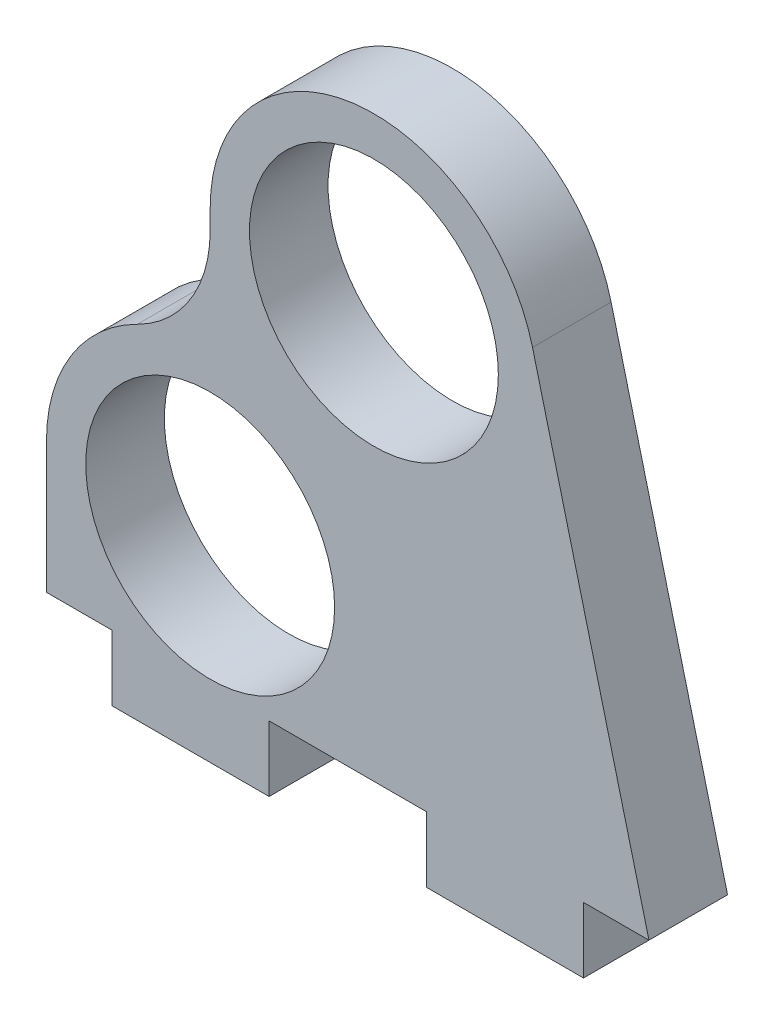
ISO-10303-21;
HEADER;
FILE_DESCRIPTION(('STEP AP214'),'2;1');
FILE_NAME('part.step','',(''),(''),'','','');
FILE_SCHEMA(('AUTOMOTIVE_DESIGN { 1 0 10303 214 1 1 1 1 }'));
ENDSEC;
DATA;
#1=APPLICATION_CONTEXT('core data for automotive mechanical design processes');
#2=APPLICATION_PROTOCOL_DEFINITION('international standard','automotive_design',2000,#1);
#3=PRODUCT_CONTEXT('',#1,'mechanical');
#4=PRODUCT('Part','Part','',(#3));
#5=PRODUCT_RELATED_PRODUCT_CATEGORY('part','',(#4));
#6=PRODUCT_DEFINITION_FORMATION('','',#4);
#7=PRODUCT_DEFINITION_CONTEXT('part definition',#1,'design');
#8=PRODUCT_DEFINITION('design','',#6,#7);
#9=PRODUCT_DEFINITION_SHAPE('','',#8);
#10=(LENGTH_UNIT() NAMED_UNIT(*) SI_UNIT(.MILLI.,.METRE.));
#11=(NAMED_UNIT(*) PLANE_ANGLE_UNIT() SI_UNIT($,.RADIAN.));
#12=(NAMED_UNIT(*) SI_UNIT($,.STERADIAN.) SOLID_ANGLE_UNIT());
#13=UNCERTAINTY_MEASURE_WITH_UNIT(LENGTH_MEASURE(1.E-05),#10,'distance_accuracy_value','');
#14=(GEOMETRIC_REPRESENTATION_CONTEXT(3) GLOBAL_UNCERTAINTY_ASSIGNED_CONTEXT((#13)) GLOBAL_UNIT_ASSIGNED_CONTEXT((#10,
#11,#12)) REPRESENTATION_CONTEXT('',''));
#15=CARTESIAN_POINT('',(0.,0.,0.));
#16=DIRECTION('',(0.,0.,1.));
#17=DIRECTION('',(1.,0.,0.));
#18=AXIS2_PLACEMENT_3D('',#15,#16,#17);
#19=CARTESIAN_POINT('',(12.5000000000001,21.6506350946109,6.));
#20=DIRECTION('',(0.,0.,1.));
#21=DIRECTION('',(1.,0.,0.));
#22=AXIS2_PLACEMENT_3D('',#19,#20,#21);
#23=PLANE('',#22);
#24=CARTESIAN_POINT('',(0.,0.,6.));
#25=DIRECTION('',(0.,0.,1.));
#26=DIRECTION('',(1.,0.,0.));
#27=AXIS2_PLACEMENT_3D('',#24,#25,#26);
#28=CIRCLE('',#27,9.5);
#29=CARTESIAN_POINT('',(9.5,0.,6.));
#30=VERTEX_POINT('',#29);
#31=EDGE_CURVE('E176',#30,#30,#28,.T.);
#32=ORIENTED_EDGE('',*,*,#31,.F.);
#33=EDGE_LOOP('',(#32));
#34=FACE_BOUND('',#33,.T.);
#35=DIRECTION('',(1.,0.,0.));
#36=VECTOR('',#35,1.);
#37=CARTESIAN_POINT('',(-12.5,-10.,6.));
#38=LINE('',#37,#36);
#39=CARTESIAN_POINT('',(-12.5,-10.,6.));
#40=VERTEX_POINT('',#39);
#41=CARTESIAN_POINT('',(-7.5,-10.,6.));
#42=VERTEX_POINT('',#41);
#43=EDGE_CURVE('E201',#40,#42,#38,.T.);
#44=ORIENTED_EDGE('',*,*,#43,.T.);
#45=DIRECTION('',(0.,-1.,0.));
#46=VECTOR('',#45,1.);
#47=CARTESIAN_POINT('',(-7.5,-15.,6.));
#48=LINE('',#47,#46);
#49=CARTESIAN_POINT('',(-7.5,-15.,6.));
#50=VERTEX_POINT('',#49);
#51=EDGE_CURVE('E114',#42,#50,#48,.T.);
#52=ORIENTED_EDGE('',*,*,#51,.T.);
#53=DIRECTION('',(1.,0.,0.));
#54=VECTOR('',#53,1.);
#55=CARTESIAN_POINT('',(4.5,-15.,6.));
#56=LINE('',#55,#54);
#57=CARTESIAN_POINT('',(4.5,-15.,6.));
#58=VERTEX_POINT('',#57);
#59=EDGE_CURVE('E237',#50,#58,#56,.T.);
#60=ORIENTED_EDGE('',*,*,#59,.T.);
#61=DIRECTION('',(0.,1.,0.));
#62=VECTOR('',#61,1.);
#63=CARTESIAN_POINT('',(4.5,-15.,6.));
#64=LINE('',#63,#62);
#65=CARTESIAN_POINT('',(4.5,-10.,6.));
#66=VERTEX_POINT('',#65);
#67=EDGE_CURVE('E256',#58,#66,#64,.T.);
#68=ORIENTED_EDGE('',*,*,#67,.T.);
#69=DIRECTION('',(1.,0.,0.));
#70=VECTOR('',#69,1.);
#71=CARTESIAN_POINT('',(16.5,-10.,6.));
#72=LINE('',#71,#70);
#73=CARTESIAN_POINT('',(16.5,-10.,6.));
#74=VERTEX_POINT('',#73);
#75=EDGE_CURVE('E253',#66,#74,#72,.T.);
#76=ORIENTED_EDGE('',*,*,#75,.T.);
#77=DIRECTION('',(0.,-1.,0.));
#78=VECTOR('',#77,1.);
#79=CARTESIAN_POINT('',(16.5,-15.,6.));
#80=LINE('',#79,#78);
#81=CARTESIAN_POINT('',(16.5,-15.,6.));
#82=VERTEX_POINT('',#81);
#83=EDGE_CURVE('E255',#74,#82,#80,.T.);
#84=ORIENTED_EDGE('',*,*,#83,.T.);
#85=DIRECTION('',(1.,0.,0.));
#86=VECTOR('',#85,1.);
#87=CARTESIAN_POINT('',(28.5,-15.,6.));
#88=LINE('',#87,#86);
#89=CARTESIAN_POINT('',(28.5,-15.,6.));
#90=VERTEX_POINT('',#89);
#91=EDGE_CURVE('E258',#82,#90,#88,.T.);
#92=ORIENTED_EDGE('',*,*,#91,.T.);
#93=DIRECTION('',(0.,1.,0.));
#94=VECTOR('',#93,1.);
#95=CARTESIAN_POINT('',(28.5,-15.,6.));
#96=LINE('',#95,#94);
#97=CARTESIAN_POINT('',(28.5,-10.,6.));
#98=VERTEX_POINT('',#97);
#99=EDGE_CURVE('E264',#90,#98,#96,.T.);
#100=ORIENTED_EDGE('',*,*,#99,.T.);
#101=DIRECTION('',(1.,0.,0.));
#102=VECTOR('',#101,1.);
#103=CARTESIAN_POINT('',(28.5,-10.,6.));
#104=LINE('',#103,#102);
#105=CARTESIAN_POINT('',(33.5,-10.,6.));
#106=VERTEX_POINT('',#105);
#107=EDGE_CURVE('E266',#98,#106,#104,.T.);
#108=ORIENTED_EDGE('',*,*,#107,.T.);
#109=DIRECTION('',(-0.247854237885738,0.96879733523688,0.));
#110=VECTOR('',#109,1.);
#111=CARTESIAN_POINT('',(33.5,-10.,6.));
#112=LINE('',#111,#110);
#113=CARTESIAN_POINT('',(24.6099666904611,24.7488130681826,6.));
#114=VERTEX_POINT('',#113);
#115=EDGE_CURVE('E268',#106,#114,#112,.T.);
#116=ORIENTED_EDGE('',*,*,#115,.T.);
#117=CARTESIAN_POINT('',(12.5000000000001,21.6506350946109,6.));
#118=DIRECTION('',(0.,0.,1.));
#119=DIRECTION('',(1.,0.,0.));
#120=AXIS2_PLACEMENT_3D('',#117,#118,#119);
#121=CIRCLE('',#120,12.5);
#122=CARTESIAN_POINT('',(0.,21.6506350946108,6.));
#123=VERTEX_POINT('',#122);
#124=EDGE_CURVE('E270',#114,#123,#121,.T.);
#125=ORIENTED_EDGE('',*,*,#124,.T.);
#126=DIRECTION('',(0.,-1.,0.));
#127=VECTOR('',#126,1.);
#128=CARTESIAN_POINT('',(0.,21.6506350946108,6.));
#129=LINE('',#128,#127);
#130=CARTESIAN_POINT('',(0.,20.1556443707463,6.));
#131=VERTEX_POINT('',#130);
#132=EDGE_CURVE('E154',#123,#131,#129,.T.);
#133=ORIENTED_EDGE('',*,*,#132,.T.);
#134=CARTESIAN_POINT('',(-9.99999999999992,20.1556443707464,6.));
#135=DIRECTION('',(0.,0.,-1.));
#136=DIRECTION('',(-1.,0.,0.));
#137=AXIS2_PLACEMENT_3D('',#134,#135,#136);
#138=CIRCLE('',#137,10.);
#139=CARTESIAN_POINT('',(-5.55555555555551,11.1975802059702,6.));
#140=VERTEX_POINT('',#139);
#141=EDGE_CURVE('E148',#131,#140,#138,.T.);
#142=ORIENTED_EDGE('',*,*,#141,.T.);
#143=CARTESIAN_POINT('',(0.,0.,6.));
#144=DIRECTION('',(0.,0.,1.));
#145=DIRECTION('',(1.,0.,0.));
#146=AXIS2_PLACEMENT_3D('',#143,#144,#145);
#147=CIRCLE('',#146,12.5);
#148=CARTESIAN_POINT('',(-12.5,0.,6.));
#149=VERTEX_POINT('',#148);
#150=EDGE_CURVE('E152',#140,#149,#147,.T.);
#151=ORIENTED_EDGE('',*,*,#150,.T.);
#152=DIRECTION('',(0.,-1.,0.));
#153=VECTOR('',#152,1.);
#154=CARTESIAN_POINT('',(-12.5,0.,6.));
#155=LINE('',#154,#153);
#156=EDGE_CURVE('E50',#149,#40,#155,.T.);
#157=ORIENTED_EDGE('',*,*,#156,.T.);
#158=EDGE_LOOP('',(#44,#52,#60,#68,#76,#84,#92,#100,#108,#116,#125,#133,#142,#151,#157));
#159=FACE_BOUND('',#158,.T.);
#160=CARTESIAN_POINT('',(12.5000000000001,21.6506350946109,6.));
#161=DIRECTION('',(0.,0.,1.));
#162=DIRECTION('',(1.,0.,0.));
#163=AXIS2_PLACEMENT_3D('',#160,#161,#162);
#164=CIRCLE('',#163,9.5);
#165=CARTESIAN_POINT('',(22.0000000000001,21.6506350946109,6.));
#166=VERTEX_POINT('',#165);
#167=EDGE_CURVE('E312',#166,#166,#164,.T.);
#168=ORIENTED_EDGE('',*,*,#167,.F.);
#169=EDGE_LOOP('',(#168));
#170=FACE_BOUND('',#169,.T.);
#171=ADVANCED_FACE('F33',(#34,#159,#170),#23,.T.);
#172=CARTESIAN_POINT('',(12.5000000000001,21.6506350946109,0.));
#173=DIRECTION('',(0.,0.,1.));
#174=DIRECTION('',(1.,0.,0.));
#175=AXIS2_PLACEMENT_3D('',#172,#173,#174);
#176=PLANE('',#175);
#177=DIRECTION('',(1.,0.,0.));
#178=VECTOR('',#177,1.);
#179=CARTESIAN_POINT('',(-12.5,-10.,0.));
#180=LINE('',#179,#178);
#181=CARTESIAN_POINT('',(-12.5,-10.,0.));
#182=VERTEX_POINT('',#181);
#183=CARTESIAN_POINT('',(-7.5,-10.,0.));
#184=VERTEX_POINT('',#183);
#185=EDGE_CURVE('E172',#182,#184,#180,.T.);
#186=ORIENTED_EDGE('',*,*,#185,.F.);
#187=DIRECTION('',(0.,-1.,0.));
#188=VECTOR('',#187,1.);
#189=CARTESIAN_POINT('',(-12.5,0.,0.));
#190=LINE('',#189,#188);
#191=CARTESIAN_POINT('',(-12.5,0.,0.));
#192=VERTEX_POINT('',#191);
#193=EDGE_CURVE('E106',#192,#182,#190,.T.);
#194=ORIENTED_EDGE('',*,*,#193,.F.);
#195=CARTESIAN_POINT('',(0.,0.,0.));
#196=DIRECTION('',(0.,0.,1.));
#197=DIRECTION('',(1.,0.,0.));
#198=AXIS2_PLACEMENT_3D('',#195,#196,#197);
#199=CIRCLE('',#198,12.5);
#200=CARTESIAN_POINT('',(-5.55555555555551,11.1975802059702,0.));
#201=VERTEX_POINT('',#200);
#202=EDGE_CURVE('E100',#201,#192,#199,.T.);
#203=ORIENTED_EDGE('',*,*,#202,.F.);
#204=CARTESIAN_POINT('',(-9.99999999999992,20.1556443707464,0.));
#205=DIRECTION('',(0.,0.,-1.));
#206=DIRECTION('',(-1.,0.,0.));
#207=AXIS2_PLACEMENT_3D('',#204,#205,#206);
#208=CIRCLE('',#207,10.);
#209=CARTESIAN_POINT('',(0.,20.1556443707463,0.));
#210=VERTEX_POINT('',#209);
#211=EDGE_CURVE('E162',#210,#201,#208,.T.);
#212=ORIENTED_EDGE('',*,*,#211,.F.);
#213=DIRECTION('',(0.,-1.,0.));
#214=VECTOR('',#213,1.);
#215=CARTESIAN_POINT('',(0.,21.6506350946108,0.));
#216=LINE('',#215,#214);
#217=CARTESIAN_POINT('',(0.,21.6506350946108,0.));
#218=VERTEX_POINT('',#217);
#219=EDGE_CURVE('E196',#218,#210,#216,.T.);
#220=ORIENTED_EDGE('',*,*,#219,.F.);
#221=CARTESIAN_POINT('',(12.5000000000001,21.6506350946109,0.));
#222=DIRECTION('',(0.,0.,1.));
#223=DIRECTION('',(1.,0.,0.));
#224=AXIS2_PLACEMENT_3D('',#221,#222,#223);
#225=CIRCLE('',#224,12.5);
#226=CARTESIAN_POINT('',(24.6099666904611,24.7488130681826,0.));
#227=VERTEX_POINT('',#226);
#228=EDGE_CURVE('E194',#227,#218,#225,.T.);
#229=ORIENTED_EDGE('',*,*,#228,.F.);
#230=DIRECTION('',(-0.247854237885738,0.96879733523688,0.));
#231=VECTOR('',#230,1.);
#232=CARTESIAN_POINT('',(33.5,-10.,0.));
#233=LINE('',#232,#231);
#234=CARTESIAN_POINT('',(33.5,-10.,0.));
#235=VERTEX_POINT('',#234);
#236=EDGE_CURVE('E192',#235,#227,#233,.T.);
#237=ORIENTED_EDGE('',*,*,#236,.F.);
#238=DIRECTION('',(1.,0.,0.));
#239=VECTOR('',#238,1.);
#240=CARTESIAN_POINT('',(28.5,-10.,0.));
#241=LINE('',#240,#239);
#242=CARTESIAN_POINT('',(28.5,-10.,0.));
#243=VERTEX_POINT('',#242);
#244=EDGE_CURVE('E190',#243,#235,#241,.T.);
#245=ORIENTED_EDGE('',*,*,#244,.F.);
#246=DIRECTION('',(0.,1.,0.));
#247=VECTOR('',#246,1.);
#248=CARTESIAN_POINT('',(28.5,-15.,0.));
#249=LINE('',#248,#247);
#250=CARTESIAN_POINT('',(28.5,-15.,0.));
#251=VERTEX_POINT('',#250);
#252=EDGE_CURVE('E188',#251,#243,#249,.T.);
#253=ORIENTED_EDGE('',*,*,#252,.F.);
#254=DIRECTION('',(1.,0.,0.));
#255=VECTOR('',#254,1.);
#256=CARTESIAN_POINT('',(28.5,-15.,0.));
#257=LINE('',#256,#255);
#258=CARTESIAN_POINT('',(16.5,-15.,0.));
#259=VERTEX_POINT('',#258);
#260=EDGE_CURVE('E186',#259,#251,#257,.T.);
#261=ORIENTED_EDGE('',*,*,#260,.F.);
#262=DIRECTION('',(0.,-1.,0.));
#263=VECTOR('',#262,1.);
#264=CARTESIAN_POINT('',(16.5,-15.,0.));
#265=LINE('',#264,#263);
#266=CARTESIAN_POINT('',(16.5,-10.,0.));
#267=VERTEX_POINT('',#266);
#268=EDGE_CURVE('E184',#267,#259,#265,.T.);
#269=ORIENTED_EDGE('',*,*,#268,.F.);
#270=DIRECTION('',(1.,0.,0.));
#271=VECTOR('',#270,1.);
#272=CARTESIAN_POINT('',(16.5,-10.,0.));
#273=LINE('',#272,#271);
#274=CARTESIAN_POINT('',(4.5,-10.,0.));
#275=VERTEX_POINT('',#274);
#276=EDGE_CURVE('E182',#275,#267,#273,.T.);
#277=ORIENTED_EDGE('',*,*,#276,.F.);
#278=DIRECTION('',(0.,1.,0.));
#279=VECTOR('',#278,1.);
#280=CARTESIAN_POINT('',(4.5,-15.,0.));
#281=LINE('',#280,#279);
#282=CARTESIAN_POINT('',(4.5,-15.,0.));
#283=VERTEX_POINT('',#282);
#284=EDGE_CURVE('E180',#283,#275,#281,.T.);
#285=ORIENTED_EDGE('',*,*,#284,.F.);
#286=DIRECTION('',(1.,0.,0.));
#287=VECTOR('',#286,1.);
#288=CARTESIAN_POINT('',(4.5,-15.,0.));
#289=LINE('',#288,#287);
#290=CARTESIAN_POINT('',(-7.5,-15.,0.));
#291=VERTEX_POINT('',#290);
#292=EDGE_CURVE('E178',#291,#283,#289,.T.);
#293=ORIENTED_EDGE('',*,*,#292,.F.);
#294=DIRECTION('',(0.,-1.,0.));
#295=VECTOR('',#294,1.);
#296=CARTESIAN_POINT('',(-7.5,-15.,0.));
#297=LINE('',#296,#295);
#298=EDGE_CURVE('E175',#184,#291,#297,.T.);
#299=ORIENTED_EDGE('',*,*,#298,.F.);
#300=EDGE_LOOP('',(#186,#194,#203,#212,#220,#229,#237,#245,#253,#261,#269,#277,#285,#293,#299));
#301=FACE_BOUND('',#300,.T.);
#302=CARTESIAN_POINT('',(0.,0.,0.));
#303=DIRECTION('',(0.,0.,1.));
#304=DIRECTION('',(1.,0.,0.));
#305=AXIS2_PLACEMENT_3D('',#302,#303,#304);
#306=CIRCLE('',#305,9.5);
#307=CARTESIAN_POINT('',(9.5,0.,0.));
#308=VERTEX_POINT('',#307);
#309=EDGE_CURVE('E318',#308,#308,#306,.T.);
#310=ORIENTED_EDGE('',*,*,#309,.T.);
#311=EDGE_LOOP('',(#310));
#312=FACE_BOUND('',#311,.T.);
#313=CARTESIAN_POINT('',(12.5000000000001,21.6506350946109,0.));
#314=DIRECTION('',(0.,0.,1.));
#315=DIRECTION('',(1.,0.,0.));
#316=AXIS2_PLACEMENT_3D('',#313,#314,#315);
#317=CIRCLE('',#316,9.5);
#318=CARTESIAN_POINT('',(22.0000000000001,21.6506350946109,0.));
#319=VERTEX_POINT('',#318);
#320=EDGE_CURVE('E315',#319,#319,#317,.T.);
#321=ORIENTED_EDGE('',*,*,#320,.T.);
#322=EDGE_LOOP('',(#321));
#323=FACE_BOUND('',#322,.T.);
#324=ADVANCED_FACE('F241',(#301,#312,#323),#176,.F.);
#325=CARTESIAN_POINT('',(-12.5,-10.,6.));
#326=DIRECTION('',(0.,1.,0.));
#327=DIRECTION('',(-1.,0.,0.));
#328=AXIS2_PLACEMENT_3D('',#325,#326,#327);
#329=PLANE('',#328);
#330=ORIENTED_EDGE('',*,*,#185,.T.);
#331=DIRECTION('',(0.,0.,-1.));
#332=VECTOR('',#331,1.);
#333=CARTESIAN_POINT('',(-7.5,-10.,6.));
#334=LINE('',#333,#332);
#335=EDGE_CURVE('E11',#42,#184,#334,.T.);
#336=ORIENTED_EDGE('',*,*,#335,.F.);
#337=ORIENTED_EDGE('',*,*,#43,.F.);
#338=DIRECTION('',(0.,0.,-1.));
#339=VECTOR('',#338,1.);
#340=CARTESIAN_POINT('',(-12.5,-10.,6.));
#341=LINE('',#340,#339);
#342=EDGE_CURVE('E168',#40,#182,#341,.T.);
#343=ORIENTED_EDGE('',*,*,#342,.T.);
#344=EDGE_LOOP('',(#330,#336,#337,#343));
#345=FACE_BOUND('',#344,.T.);
#346=ADVANCED_FACE('F35',(#345),#329,.F.);
#347=CARTESIAN_POINT('',(-7.5,-15.,6.));
#348=DIRECTION('',(1.,0.,0.));
#349=DIRECTION('',(0.,0.,-1.));
#350=AXIS2_PLACEMENT_3D('',#347,#348,#349);
#351=PLANE('',#350);
#352=ORIENTED_EDGE('',*,*,#298,.T.);
#353=DIRECTION('',(0.,0.,-1.));
#354=VECTOR('',#353,1.);
#355=CARTESIAN_POINT('',(-7.5,-15.,6.));
#356=LINE('',#355,#354);
#357=EDGE_CURVE('E42',#50,#291,#356,.T.);
#358=ORIENTED_EDGE('',*,*,#357,.F.);
#359=ORIENTED_EDGE('',*,*,#51,.F.);
#360=ORIENTED_EDGE('',*,*,#335,.T.);
#361=EDGE_LOOP('',(#352,#358,#359,#360));
#362=FACE_BOUND('',#361,.T.);
#363=ADVANCED_FACE('F441',(#362),#351,.F.);
#364=CARTESIAN_POINT('',(4.5,-15.,6.));
#365=DIRECTION('',(0.,1.,0.));
#366=DIRECTION('',(-1.,0.,0.));
#367=AXIS2_PLACEMENT_3D('',#364,#365,#366);
#368=PLANE('',#367);
#369=ORIENTED_EDGE('',*,*,#292,.T.);
#370=DIRECTION('',(0.,0.,-1.));
#371=VECTOR('',#370,1.);
#372=CARTESIAN_POINT('',(4.5,-15.,6.));
#373=LINE('',#372,#371);
#374=EDGE_CURVE('E229',#58,#283,#373,.T.);
#375=ORIENTED_EDGE('',*,*,#374,.F.);
#376=ORIENTED_EDGE('',*,*,#59,.F.);
#377=ORIENTED_EDGE('',*,*,#357,.T.);
#378=EDGE_LOOP('',(#369,#375,#376,#377));
#379=FACE_BOUND('',#378,.T.);
#380=ADVANCED_FACE('F235',(#379),#368,.F.);
#381=CARTESIAN_POINT('',(4.5,-15.,6.));
#382=DIRECTION('',(-1.,0.,0.));
#383=DIRECTION('',(0.,0.,1.));
#384=AXIS2_PLACEMENT_3D('',#381,#382,#383);
#385=PLANE('',#384);
#386=ORIENTED_EDGE('',*,*,#284,.T.);
#387=DIRECTION('',(0.,0.,-1.));
#388=VECTOR('',#387,1.);
#389=CARTESIAN_POINT('',(4.5,-10.,6.));
#390=LINE('',#389,#388);
#391=EDGE_CURVE('E226',#66,#275,#390,.T.);
#392=ORIENTED_EDGE('',*,*,#391,.F.);
#393=ORIENTED_EDGE('',*,*,#67,.F.);
#394=ORIENTED_EDGE('',*,*,#374,.T.);
#395=EDGE_LOOP('',(#386,#392,#393,#394));
#396=FACE_BOUND('',#395,.T.);
#397=ADVANCED_FACE('F247',(#396),#385,.F.);
#398=CARTESIAN_POINT('',(16.5,-10.,6.));
#399=DIRECTION('',(0.,1.,0.));
#400=DIRECTION('',(-1.,0.,0.));
#401=AXIS2_PLACEMENT_3D('',#398,#399,#400);
#402=PLANE('',#401);
#403=ORIENTED_EDGE('',*,*,#276,.T.);
#404=DIRECTION('',(0.,0.,-1.));
#405=VECTOR('',#404,1.);
#406=CARTESIAN_POINT('',(16.5,-10.,6.));
#407=LINE('',#406,#405);
#408=EDGE_CURVE('E223',#74,#267,#407,.T.);
#409=ORIENTED_EDGE('',*,*,#408,.F.);
#410=ORIENTED_EDGE('',*,*,#75,.F.);
#411=ORIENTED_EDGE('',*,*,#391,.T.);
#412=EDGE_LOOP('',(#403,#409,#410,#411));
#413=FACE_BOUND('',#412,.T.);
#414=ADVANCED_FACE('F251',(#413),#402,.F.);
#415=CARTESIAN_POINT('',(16.5,-15.,6.));
#416=DIRECTION('',(1.,0.,0.));
#417=DIRECTION('',(0.,0.,-1.));
#418=AXIS2_PLACEMENT_3D('',#415,#416,#417);
#419=PLANE('',#418);
#420=ORIENTED_EDGE('',*,*,#268,.T.);
#421=DIRECTION('',(0.,0.,-1.));
#422=VECTOR('',#421,1.);
#423=CARTESIAN_POINT('',(16.5,-15.,6.));
#424=LINE('',#423,#422);
#425=EDGE_CURVE('E220',#82,#259,#424,.T.);
#426=ORIENTED_EDGE('',*,*,#425,.F.);
#427=ORIENTED_EDGE('',*,*,#83,.F.);
#428=ORIENTED_EDGE('',*,*,#408,.T.);
#429=EDGE_LOOP('',(#420,#426,#427,#428));
#430=FACE_BOUND('',#429,.T.);
#431=ADVANCED_FACE('F406',(#430),#419,.F.);
#432=CARTESIAN_POINT('',(28.5,-15.,6.));
#433=DIRECTION('',(0.,1.,0.));
#434=DIRECTION('',(-1.,0.,0.));
#435=AXIS2_PLACEMENT_3D('',#432,#433,#434);
#436=PLANE('',#435);
#437=ORIENTED_EDGE('',*,*,#260,.T.);
#438=DIRECTION('',(0.,0.,-1.));
#439=VECTOR('',#438,1.);
#440=CARTESIAN_POINT('',(28.5,-15.,6.));
#441=LINE('',#440,#439);
#442=EDGE_CURVE('E217',#90,#251,#441,.T.);
#443=ORIENTED_EDGE('',*,*,#442,.F.);
#444=ORIENTED_EDGE('',*,*,#91,.F.);
#445=ORIENTED_EDGE('',*,*,#425,.T.);
#446=EDGE_LOOP('',(#437,#443,#444,#445));
#447=FACE_BOUND('',#446,.T.);
#448=ADVANCED_FACE('F396',(#447),#436,.F.);
#449=CARTESIAN_POINT('',(28.5,-15.,6.));
#450=DIRECTION('',(-1.,0.,0.));
#451=DIRECTION('',(0.,0.,1.));
#452=AXIS2_PLACEMENT_3D('',#449,#450,#451);
#453=PLANE('',#452);
#454=ORIENTED_EDGE('',*,*,#252,.T.);
#455=DIRECTION('',(0.,0.,-1.));
#456=VECTOR('',#455,1.);
#457=CARTESIAN_POINT('',(28.5,-10.,6.));
#458=LINE('',#457,#456);
#459=EDGE_CURVE('E214',#98,#243,#458,.T.);
#460=ORIENTED_EDGE('',*,*,#459,.F.);
#461=ORIENTED_EDGE('',*,*,#99,.F.);
#462=ORIENTED_EDGE('',*,*,#442,.T.);
#463=EDGE_LOOP('',(#454,#460,#461,#462));
#464=FACE_BOUND('',#463,.T.);
#465=ADVANCED_FACE('F386',(#464),#453,.F.);
#466=CARTESIAN_POINT('',(28.5,-10.,6.));
#467=DIRECTION('',(0.,1.,0.));
#468=DIRECTION('',(0.,0.,1.));
#469=AXIS2_PLACEMENT_3D('',#466,#467,#468);
#470=PLANE('',#469);
#471=ORIENTED_EDGE('',*,*,#244,.T.);
#472=DIRECTION('',(0.,0.,-1.));
#473=VECTOR('',#472,1.);
#474=CARTESIAN_POINT('',(33.5,-10.,6.));
#475=LINE('',#474,#473);
#476=EDGE_CURVE('E211',#106,#235,#475,.T.);
#477=ORIENTED_EDGE('',*,*,#476,.F.);
#478=ORIENTED_EDGE('',*,*,#107,.F.);
#479=ORIENTED_EDGE('',*,*,#459,.T.);
#480=EDGE_LOOP('',(#471,#477,#478,#479));
#481=FACE_BOUND('',#480,.T.);
#482=ADVANCED_FACE('F376',(#481),#470,.F.);
#483=CARTESIAN_POINT('',(33.5,-10.,6.));
#484=DIRECTION('',(-0.96879733523688,-0.247854237885738,0.));
#485=DIRECTION('',(0.247854237885738,-0.96879733523688,0.));
#486=AXIS2_PLACEMENT_3D('',#483,#484,#485);
#487=PLANE('',#486);
#488=ORIENTED_EDGE('',*,*,#236,.T.);
#489=DIRECTION('',(0.,0.,-1.));
#490=VECTOR('',#489,1.);
#491=CARTESIAN_POINT('',(24.6099666904611,24.7488130681826,6.));
#492=LINE('',#491,#490);
#493=EDGE_CURVE('E208',#114,#227,#492,.T.);
#494=ORIENTED_EDGE('',*,*,#493,.F.);
#495=ORIENTED_EDGE('',*,*,#115,.F.);
#496=ORIENTED_EDGE('',*,*,#476,.T.);
#497=EDGE_LOOP('',(#488,#494,#495,#496));
#498=FACE_BOUND('',#497,.T.);
#499=ADVANCED_FACE('F367',(#498),#487,.F.);
#500=CARTESIAN_POINT('',(12.5000000000001,21.6506350946109,6.));
#501=DIRECTION('',(0.,0.,-1.));
#502=DIRECTION('',(-1.,0.,0.));
#503=AXIS2_PLACEMENT_3D('',#500,#501,#502);
#504=CYLINDRICAL_SURFACE('',#503,12.5);
#505=ORIENTED_EDGE('',*,*,#228,.T.);
#506=DIRECTION('',(0.,0.,-1.));
#507=VECTOR('',#506,1.);
#508=CARTESIAN_POINT('',(0.,21.6506350946108,6.));
#509=LINE('',#508,#507);
#510=EDGE_CURVE('E205',#123,#218,#509,.T.);
#511=ORIENTED_EDGE('',*,*,#510,.F.);
#512=ORIENTED_EDGE('',*,*,#124,.F.);
#513=ORIENTED_EDGE('',*,*,#493,.T.);
#514=EDGE_LOOP('',(#505,#511,#512,#513));
#515=FACE_BOUND('',#514,.T.);
#516=ADVANCED_FACE('F276',(#515),#504,.T.);
#517=CARTESIAN_POINT('',(0.,21.6506350946108,6.));
#518=DIRECTION('',(1.,0.,0.));
#519=DIRECTION('',(0.,1.,0.));
#520=AXIS2_PLACEMENT_3D('',#517,#518,#519);
#521=PLANE('',#520);
#522=ORIENTED_EDGE('',*,*,#219,.T.);
#523=DIRECTION('',(0.,0.,-1.));
#524=VECTOR('',#523,1.);
#525=CARTESIAN_POINT('',(0.,20.1556443707463,6.));
#526=LINE('',#525,#524);
#527=EDGE_CURVE('E163',#131,#210,#526,.T.);
#528=ORIENTED_EDGE('',*,*,#527,.F.);
#529=ORIENTED_EDGE('',*,*,#132,.F.);
#530=ORIENTED_EDGE('',*,*,#510,.T.);
#531=EDGE_LOOP('',(#522,#528,#529,#530));
#532=FACE_BOUND('',#531,.T.);
#533=ADVANCED_FACE('F280',(#532),#521,.F.);
#534=CARTESIAN_POINT('',(-9.99999999999992,20.1556443707464,6.));
#535=DIRECTION('',(0.,0.,-1.));
#536=DIRECTION('',(-1.,0.,0.));
#537=AXIS2_PLACEMENT_3D('',#534,#535,#536);
#538=CYLINDRICAL_SURFACE('',#537,10.);
#539=ORIENTED_EDGE('',*,*,#211,.T.);
#540=DIRECTION('',(0.,0.,-1.));
#541=VECTOR('',#540,1.);
#542=CARTESIAN_POINT('',(-5.55555555555551,11.1975802059702,6.));
#543=LINE('',#542,#541);
#544=EDGE_CURVE('E159',#140,#201,#543,.T.);
#545=ORIENTED_EDGE('',*,*,#544,.F.);
#546=ORIENTED_EDGE('',*,*,#141,.F.);
#547=ORIENTED_EDGE('',*,*,#527,.T.);
#548=EDGE_LOOP('',(#539,#545,#546,#547));
#549=FACE_BOUND('',#548,.T.);
#550=ADVANCED_FACE('F160',(#549),#538,.F.);
#551=CARTESIAN_POINT('',(0.,0.,6.));
#552=DIRECTION('',(0.,0.,-1.));
#553=DIRECTION('',(-1.,0.,0.));
#554=AXIS2_PLACEMENT_3D('',#551,#552,#553);
#555=CYLINDRICAL_SURFACE('',#554,12.5);
#556=ORIENTED_EDGE('',*,*,#202,.T.);
#557=DIRECTION('',(0.,0.,-1.));
#558=VECTOR('',#557,1.);
#559=CARTESIAN_POINT('',(-12.5,0.,6.));
#560=LINE('',#559,#558);
#561=EDGE_CURVE('E164',#149,#192,#560,.T.);
#562=ORIENTED_EDGE('',*,*,#561,.F.);
#563=ORIENTED_EDGE('',*,*,#150,.F.);
#564=ORIENTED_EDGE('',*,*,#544,.T.);
#565=EDGE_LOOP('',(#556,#562,#563,#564));
#566=FACE_BOUND('',#565,.T.);
#567=ADVANCED_FACE('F166',(#566),#555,.T.);
#568=CARTESIAN_POINT('',(-12.5,0.,6.));
#569=DIRECTION('',(1.,0.,0.));
#570=DIRECTION('',(0.,1.,0.));
#571=AXIS2_PLACEMENT_3D('',#568,#569,#570);
#572=PLANE('',#571);
#573=ORIENTED_EDGE('',*,*,#193,.T.);
#574=ORIENTED_EDGE('',*,*,#342,.F.);
#575=ORIENTED_EDGE('',*,*,#156,.F.);
#576=ORIENTED_EDGE('',*,*,#561,.T.);
#577=EDGE_LOOP('',(#573,#574,#575,#576));
#578=FACE_BOUND('',#577,.T.);
#579=ADVANCED_FACE('F284',(#578),#572,.F.);
#580=CARTESIAN_POINT('',(0.,0.,6.));
#581=DIRECTION('',(0.,0.,-1.));
#582=DIRECTION('',(-1.,0.,0.));
#583=AXIS2_PLACEMENT_3D('',#580,#581,#582);
#584=CYLINDRICAL_SURFACE('',#583,9.5);
#585=ORIENTED_EDGE('',*,*,#31,.T.);
#586=EDGE_LOOP('',(#585));
#587=FACE_BOUND('',#586,.T.);
#588=ORIENTED_EDGE('',*,*,#309,.F.);
#589=EDGE_LOOP('',(#588));
#590=FACE_BOUND('',#589,.T.);
#591=ADVANCED_FACE('F286',(#587,#590),#584,.F.);
#592=CARTESIAN_POINT('',(12.5000000000001,21.6506350946109,6.));
#593=DIRECTION('',(0.,0.,-1.));
#594=DIRECTION('',(-1.,0.,0.));
#595=AXIS2_PLACEMENT_3D('',#592,#593,#594);
#596=CYLINDRICAL_SURFACE('',#595,9.5);
#597=ORIENTED_EDGE('',*,*,#167,.T.);
#598=EDGE_LOOP('',(#597));
#599=FACE_BOUND('',#598,.T.);
#600=ORIENTED_EDGE('',*,*,#320,.F.);
#601=EDGE_LOOP('',(#600));
#602=FACE_BOUND('',#601,.T.);
#603=ADVANCED_FACE('F292',(#599,#602),#596,.F.);
#604=CLOSED_SHELL('',(#171,#324,#346,#363,#380,#397,#414,#431,#448,#465,#482,#499,#516,#533,
#550,#567,#579,#591,#603));
#605=MANIFOLD_SOLID_BREP('B2',#604);
#606=ADVANCED_BREP_SHAPE_REPRESENTATION('',(#18,#605),#14);
#607=SHAPE_DEFINITION_REPRESENTATION(#9,#606);
ENDSEC;
END-ISO-10303-21;
